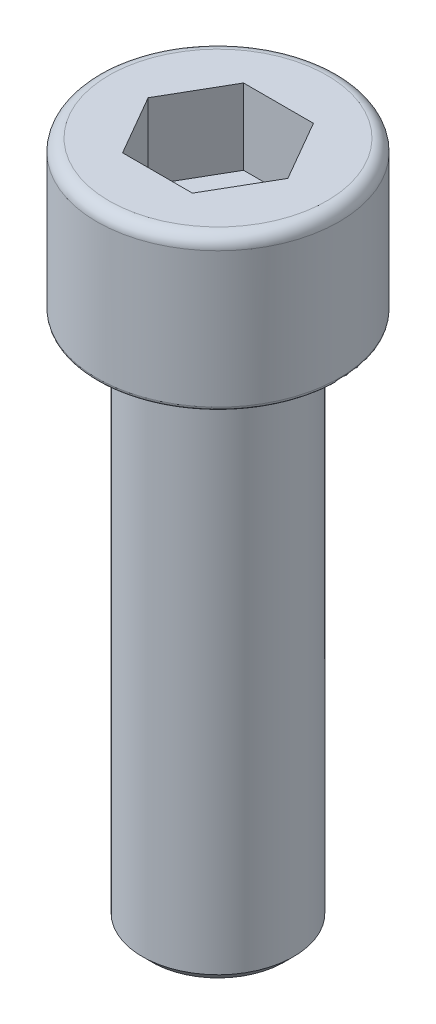
ISO-10303-21;
HEADER;
FILE_DESCRIPTION(('STEP AP214'),'2;1');
FILE_NAME('part.step','',(''),(''),'','','');
FILE_SCHEMA(('AUTOMOTIVE_DESIGN { 1 0 10303 214 1 1 1 1 }'));
ENDSEC;
DATA;
#1=APPLICATION_CONTEXT('core data for automotive mechanical design processes');
#2=APPLICATION_PROTOCOL_DEFINITION('international standard','automotive_design',2000,#1);
#3=PRODUCT_CONTEXT('',#1,'mechanical');
#4=PRODUCT('Part','Part','',(#3));
#5=PRODUCT_RELATED_PRODUCT_CATEGORY('part','',(#4));
#6=PRODUCT_DEFINITION_FORMATION('','',#4);
#7=PRODUCT_DEFINITION_CONTEXT('part definition',#1,'design');
#8=PRODUCT_DEFINITION('design','',#6,#7);
#9=PRODUCT_DEFINITION_SHAPE('','',#8);
#10=(LENGTH_UNIT() NAMED_UNIT(*) SI_UNIT(.MILLI.,.METRE.));
#11=(NAMED_UNIT(*) PLANE_ANGLE_UNIT() SI_UNIT($,.RADIAN.));
#12=(NAMED_UNIT(*) SI_UNIT($,.STERADIAN.) SOLID_ANGLE_UNIT());
#13=UNCERTAINTY_MEASURE_WITH_UNIT(LENGTH_MEASURE(1.E-05),#10,'distance_accuracy_value','');
#14=(GEOMETRIC_REPRESENTATION_CONTEXT(3) GLOBAL_UNCERTAINTY_ASSIGNED_CONTEXT((#13)) GLOBAL_UNIT_ASSIGNED_CONTEXT((#10,
#11,#12)) REPRESENTATION_CONTEXT('',''));
#15=CARTESIAN_POINT('',(0.,0.,0.));
#16=DIRECTION('',(0.,0.,1.));
#17=DIRECTION('',(1.,0.,0.));
#18=AXIS2_PLACEMENT_3D('',#15,#16,#17);
#19=CARTESIAN_POINT('',(0.,0.,0.));
#20=DIRECTION('',(0.,1.,0.));
#21=DIRECTION('',(0.,0.,1.));
#22=AXIS2_PLACEMENT_3D('',#19,#20,#21);
#23=PLANE('',#22);
#24=CARTESIAN_POINT('',(0.,0.,0.));
#25=DIRECTION('',(0.,1.,0.));
#26=DIRECTION('',(0.,0.,1.));
#27=AXIS2_PLACEMENT_3D('',#24,#25,#26);
#28=CIRCLE('',#27,7.2);
#29=CARTESIAN_POINT('',(0.,0.,7.2));
#30=VERTEX_POINT('',#29);
#31=EDGE_CURVE('E158',#30,#30,#28,.T.);
#32=ORIENTED_EDGE('',*,*,#31,.T.);
#33=EDGE_LOOP('',(#32));
#34=FACE_BOUND('',#33,.T.);
#35=DIRECTION('',(0.5,0.,-0.866025403784439));
#36=VECTOR('',#35,1.);
#37=CARTESIAN_POINT('',(2.3094010767585,0.,4.));
#38=LINE('',#37,#36);
#39=CARTESIAN_POINT('',(2.3094010767585,0.,4.));
#40=VERTEX_POINT('',#39);
#41=CARTESIAN_POINT('',(4.61880215351701,0.,0.));
#42=VERTEX_POINT('',#41);
#43=EDGE_CURVE('E63',#40,#42,#38,.T.);
#44=ORIENTED_EDGE('',*,*,#43,.F.);
#45=DIRECTION('',(1.,0.,0.));
#46=VECTOR('',#45,1.);
#47=CARTESIAN_POINT('',(-2.3094010767585,0.,4.));
#48=LINE('',#47,#46);
#49=CARTESIAN_POINT('',(-2.3094010767585,0.,4.));
#50=VERTEX_POINT('',#49);
#51=EDGE_CURVE('E146',#50,#40,#48,.T.);
#52=ORIENTED_EDGE('',*,*,#51,.F.);
#53=DIRECTION('',(0.5,0.,0.866025403784439));
#54=VECTOR('',#53,1.);
#55=CARTESIAN_POINT('',(-4.61880215351701,0.,0.));
#56=LINE('',#55,#54);
#57=CARTESIAN_POINT('',(-4.61880215351701,0.,0.));
#58=VERTEX_POINT('',#57);
#59=EDGE_CURVE('E144',#58,#50,#56,.T.);
#60=ORIENTED_EDGE('',*,*,#59,.F.);
#61=DIRECTION('',(-0.5,0.,0.866025403784439));
#62=VECTOR('',#61,1.);
#63=CARTESIAN_POINT('',(-2.3094010767585,0.,-4.));
#64=LINE('',#63,#62);
#65=CARTESIAN_POINT('',(-2.3094010767585,0.,-4.));
#66=VERTEX_POINT('',#65);
#67=EDGE_CURVE('E111',#66,#58,#64,.T.);
#68=ORIENTED_EDGE('',*,*,#67,.F.);
#69=DIRECTION('',(-1.,0.,0.));
#70=VECTOR('',#69,1.);
#71=CARTESIAN_POINT('',(2.3094010767585,0.,-4.));
#72=LINE('',#71,#70);
#73=CARTESIAN_POINT('',(2.3094010767585,0.,-4.));
#74=VERTEX_POINT('',#73);
#75=EDGE_CURVE('E140',#74,#66,#72,.T.);
#76=ORIENTED_EDGE('',*,*,#75,.F.);
#77=DIRECTION('',(-0.5,0.,-0.866025403784439));
#78=VECTOR('',#77,1.);
#79=CARTESIAN_POINT('',(4.61880215351701,0.,0.));
#80=LINE('',#79,#78);
#81=EDGE_CURVE('E137',#42,#74,#80,.T.);
#82=ORIENTED_EDGE('',*,*,#81,.F.);
#83=EDGE_LOOP('',(#44,#52,#60,#68,#76,#82));
#84=FACE_BOUND('',#83,.T.);
#85=ADVANCED_FACE('F48',(#34,#84),#23,.T.);
#86=CARTESIAN_POINT('',(0.,-50.,0.));
#87=DIRECTION('',(0.,-1.,0.));
#88=DIRECTION('',(0.,0.,-1.));
#89=AXIS2_PLACEMENT_3D('',#86,#87,#88);
#90=CYLINDRICAL_SURFACE('',#89,8.);
#91=CARTESIAN_POINT('',(0.,-9.75,0.));
#92=DIRECTION('',(0.,-1.,0.));
#93=DIRECTION('',(0.,0.,-1.));
#94=AXIS2_PLACEMENT_3D('',#91,#92,#93);
#95=CIRCLE('',#94,8.);
#96=CARTESIAN_POINT('',(0.,-9.75,-8.));
#97=VERTEX_POINT('',#96);
#98=EDGE_CURVE('E11',#97,#97,#95,.F.);
#99=ORIENTED_EDGE('',*,*,#98,.T.);
#100=EDGE_LOOP('',(#99));
#101=FACE_BOUND('',#100,.T.);
#102=CARTESIAN_POINT('',(0.,-0.800000000000002,0.));
#103=DIRECTION('',(0.,1.,0.));
#104=DIRECTION('',(0.,0.,1.));
#105=AXIS2_PLACEMENT_3D('',#102,#103,#104);
#106=CIRCLE('',#105,8.);
#107=CARTESIAN_POINT('',(0.,-0.800000000000002,8.));
#108=VERTEX_POINT('',#107);
#109=EDGE_CURVE('E150',#108,#108,#106,.F.);
#110=ORIENTED_EDGE('',*,*,#109,.T.);
#111=EDGE_LOOP('',(#110));
#112=FACE_BOUND('',#111,.T.);
#113=ADVANCED_FACE('F207',(#101,#112),#90,.T.);
#114=CARTESIAN_POINT('',(8.,-10.,0.));
#115=DIRECTION('',(0.,-1.,0.));
#116=DIRECTION('',(0.,0.,-1.));
#117=AXIS2_PLACEMENT_3D('',#114,#115,#116);
#118=PLANE('',#117);
#119=CARTESIAN_POINT('',(0.,-10.,0.));
#120=DIRECTION('',(0.,-1.,0.));
#121=DIRECTION('',(0.,0.,-1.));
#122=AXIS2_PLACEMENT_3D('',#119,#120,#121);
#123=CIRCLE('',#122,5.25);
#124=CARTESIAN_POINT('',(0.,-10.,-5.25));
#125=VERTEX_POINT('',#124);
#126=EDGE_CURVE('E56',#125,#125,#123,.F.);
#127=ORIENTED_EDGE('',*,*,#126,.T.);
#128=EDGE_LOOP('',(#127));
#129=FACE_BOUND('',#128,.T.);
#130=CARTESIAN_POINT('',(0.,-10.,0.));
#131=DIRECTION('',(0.,-1.,0.));
#132=DIRECTION('',(0.,0.,-1.));
#133=AXIS2_PLACEMENT_3D('',#130,#131,#132);
#134=CIRCLE('',#133,7.75);
#135=CARTESIAN_POINT('',(0.,-10.,-7.75));
#136=VERTEX_POINT('',#135);
#137=EDGE_CURVE('E170',#136,#136,#134,.T.);
#138=ORIENTED_EDGE('',*,*,#137,.T.);
#139=EDGE_LOOP('',(#138));
#140=FACE_BOUND('',#139,.T.);
#141=ADVANCED_FACE('F175',(#129,#140),#118,.T.);
#142=CARTESIAN_POINT('',(0.,-50.,0.));
#143=DIRECTION('',(0.,-1.,0.));
#144=DIRECTION('',(0.,0.,-1.));
#145=AXIS2_PLACEMENT_3D('',#142,#143,#144);
#146=CYLINDRICAL_SURFACE('',#145,5.);
#147=CARTESIAN_POINT('',(0.,-10.25,0.));
#148=DIRECTION('',(0.,-1.,0.));
#149=DIRECTION('',(0.,0.,-1.));
#150=AXIS2_PLACEMENT_3D('',#147,#148,#149);
#151=CIRCLE('',#150,5.);
#152=CARTESIAN_POINT('',(0.,-10.25,-5.));
#153=VERTEX_POINT('',#152);
#154=EDGE_CURVE('E167',#153,#153,#151,.T.);
#155=ORIENTED_EDGE('',*,*,#154,.T.);
#156=EDGE_LOOP('',(#155));
#157=FACE_BOUND('',#156,.T.);
#158=CARTESIAN_POINT('',(0.,-44.375,0.));
#159=DIRECTION('',(0.,-1.,0.));
#160=DIRECTION('',(0.,0.,-1.));
#161=AXIS2_PLACEMENT_3D('',#158,#159,#160);
#162=CIRCLE('',#161,5.);
#163=CARTESIAN_POINT('',(0.,-44.375,-5.));
#164=VERTEX_POINT('',#163);
#165=EDGE_CURVE('E164',#164,#164,#162,.F.);
#166=ORIENTED_EDGE('',*,*,#165,.T.);
#167=EDGE_LOOP('',(#166));
#168=FACE_BOUND('',#167,.T.);
#169=ADVANCED_FACE('F184',(#157,#168),#146,.T.);
#170=CARTESIAN_POINT('',(5.,-45.,0.));
#171=DIRECTION('',(0.,-1.,0.));
#172=DIRECTION('',(0.,0.,-1.));
#173=AXIS2_PLACEMENT_3D('',#170,#171,#172);
#174=PLANE('',#173);
#175=CARTESIAN_POINT('',(0.,-45.,0.));
#176=DIRECTION('',(0.,-1.,0.));
#177=DIRECTION('',(0.,0.,-1.));
#178=AXIS2_PLACEMENT_3D('',#175,#176,#177);
#179=CIRCLE('',#178,4.375);
#180=CARTESIAN_POINT('',(0.,-45.,-4.375));
#181=VERTEX_POINT('',#180);
#182=EDGE_CURVE('E161',#181,#181,#179,.T.);
#183=ORIENTED_EDGE('',*,*,#182,.T.);
#184=EDGE_LOOP('',(#183));
#185=FACE_BOUND('',#184,.T.);
#186=ADVANCED_FACE('F187',(#185),#174,.T.);
#187=CARTESIAN_POINT('',(2.3094010767585,-5.,4.));
#188=DIRECTION('',(0.866025403784439,0.,0.5));
#189=DIRECTION('',(0.5,0.,-0.866025403784439));
#190=AXIS2_PLACEMENT_3D('',#187,#188,#189);
#191=PLANE('',#190);
#192=ORIENTED_EDGE('',*,*,#43,.T.);
#193=DIRECTION('',(0.,1.,0.));
#194=VECTOR('',#193,1.);
#195=CARTESIAN_POINT('',(4.61880215351701,-5.,0.));
#196=LINE('',#195,#194);
#197=CARTESIAN_POINT('',(4.61880215351701,-5.,0.));
#198=VERTEX_POINT('',#197);
#199=EDGE_CURVE('E93',#198,#42,#196,.T.);
#200=ORIENTED_EDGE('',*,*,#199,.F.);
#201=DIRECTION('',(0.5,0.,-0.866025403784439));
#202=VECTOR('',#201,1.);
#203=CARTESIAN_POINT('',(2.3094010767585,-5.,4.));
#204=LINE('',#203,#202);
#205=CARTESIAN_POINT('',(2.3094010767585,-5.,4.));
#206=VERTEX_POINT('',#205);
#207=EDGE_CURVE('E148',#206,#198,#204,.T.);
#208=ORIENTED_EDGE('',*,*,#207,.F.);
#209=DIRECTION('',(0.,1.,0.));
#210=VECTOR('',#209,1.);
#211=CARTESIAN_POINT('',(2.3094010767585,-5.,4.));
#212=LINE('',#211,#210);
#213=EDGE_CURVE('E71',#206,#40,#212,.T.);
#214=ORIENTED_EDGE('',*,*,#213,.T.);
#215=EDGE_LOOP('',(#192,#200,#208,#214));
#216=FACE_BOUND('',#215,.T.);
#217=ADVANCED_FACE('F198',(#216),#191,.F.);
#218=CARTESIAN_POINT('',(-2.3094010767585,-5.,4.));
#219=DIRECTION('',(0.,0.,1.));
#220=DIRECTION('',(1.,0.,0.));
#221=AXIS2_PLACEMENT_3D('',#218,#219,#220);
#222=PLANE('',#221);
#223=ORIENTED_EDGE('',*,*,#51,.T.);
#224=ORIENTED_EDGE('',*,*,#213,.F.);
#225=DIRECTION('',(1.,0.,0.));
#226=VECTOR('',#225,1.);
#227=CARTESIAN_POINT('',(-2.3094010767585,-5.,4.));
#228=LINE('',#227,#226);
#229=CARTESIAN_POINT('',(-2.3094010767585,-5.,4.));
#230=VERTEX_POINT('',#229);
#231=EDGE_CURVE('E123',#230,#206,#228,.T.);
#232=ORIENTED_EDGE('',*,*,#231,.F.);
#233=DIRECTION('',(0.,1.,0.));
#234=VECTOR('',#233,1.);
#235=CARTESIAN_POINT('',(-2.3094010767585,-5.,4.));
#236=LINE('',#235,#234);
#237=EDGE_CURVE('E115',#230,#50,#236,.T.);
#238=ORIENTED_EDGE('',*,*,#237,.T.);
#239=EDGE_LOOP('',(#223,#224,#232,#238));
#240=FACE_BOUND('',#239,.T.);
#241=ADVANCED_FACE('F204',(#240),#222,.F.);
#242=CARTESIAN_POINT('',(-4.61880215351701,-5.,0.));
#243=DIRECTION('',(-0.866025403784438,0.,0.5));
#244=DIRECTION('',(0.5,0.,0.866025403784439));
#245=AXIS2_PLACEMENT_3D('',#242,#243,#244);
#246=PLANE('',#245);
#247=ORIENTED_EDGE('',*,*,#59,.T.);
#248=ORIENTED_EDGE('',*,*,#237,.F.);
#249=DIRECTION('',(0.5,0.,0.866025403784439));
#250=VECTOR('',#249,1.);
#251=CARTESIAN_POINT('',(-4.61880215351701,-5.,0.));
#252=LINE('',#251,#250);
#253=CARTESIAN_POINT('',(-4.61880215351701,-5.,0.));
#254=VERTEX_POINT('',#253);
#255=EDGE_CURVE('E119',#254,#230,#252,.T.);
#256=ORIENTED_EDGE('',*,*,#255,.F.);
#257=DIRECTION('',(0.,1.,0.));
#258=VECTOR('',#257,1.);
#259=CARTESIAN_POINT('',(-4.61880215351701,-5.,0.));
#260=LINE('',#259,#258);
#261=EDGE_CURVE('E104',#254,#58,#260,.T.);
#262=ORIENTED_EDGE('',*,*,#261,.T.);
#263=EDGE_LOOP('',(#247,#248,#256,#262));
#264=FACE_BOUND('',#263,.T.);
#265=ADVANCED_FACE('F120',(#264),#246,.F.);
#266=CARTESIAN_POINT('',(-2.3094010767585,-5.,-4.));
#267=DIRECTION('',(-0.866025403784439,0.,-0.5));
#268=DIRECTION('',(-0.5,0.,0.866025403784439));
#269=AXIS2_PLACEMENT_3D('',#266,#267,#268);
#270=PLANE('',#269);
#271=ORIENTED_EDGE('',*,*,#67,.T.);
#272=ORIENTED_EDGE('',*,*,#261,.F.);
#273=DIRECTION('',(-0.5,0.,0.866025403784439));
#274=VECTOR('',#273,1.);
#275=CARTESIAN_POINT('',(-2.3094010767585,-5.,-4.));
#276=LINE('',#275,#274);
#277=CARTESIAN_POINT('',(-2.3094010767585,-5.,-4.));
#278=VERTEX_POINT('',#277);
#279=EDGE_CURVE('E108',#278,#254,#276,.T.);
#280=ORIENTED_EDGE('',*,*,#279,.F.);
#281=DIRECTION('',(0.,1.,0.));
#282=VECTOR('',#281,1.);
#283=CARTESIAN_POINT('',(-2.3094010767585,-5.,-4.));
#284=LINE('',#283,#282);
#285=EDGE_CURVE('E116',#278,#66,#284,.T.);
#286=ORIENTED_EDGE('',*,*,#285,.T.);
#287=EDGE_LOOP('',(#271,#272,#280,#286));
#288=FACE_BOUND('',#287,.T.);
#289=ADVANCED_FACE('F106',(#288),#270,.F.);
#290=CARTESIAN_POINT('',(2.3094010767585,-5.,-4.));
#291=DIRECTION('',(0.,0.,-1.));
#292=DIRECTION('',(-1.,0.,0.));
#293=AXIS2_PLACEMENT_3D('',#290,#291,#292);
#294=PLANE('',#293);
#295=ORIENTED_EDGE('',*,*,#75,.T.);
#296=ORIENTED_EDGE('',*,*,#285,.F.);
#297=DIRECTION('',(-1.,0.,0.));
#298=VECTOR('',#297,1.);
#299=CARTESIAN_POINT('',(2.3094010767585,-5.,-4.));
#300=LINE('',#299,#298);
#301=CARTESIAN_POINT('',(2.3094010767585,-5.,-4.));
#302=VERTEX_POINT('',#301);
#303=EDGE_CURVE('E129',#302,#278,#300,.T.);
#304=ORIENTED_EDGE('',*,*,#303,.F.);
#305=DIRECTION('',(0.,1.,0.));
#306=VECTOR('',#305,1.);
#307=CARTESIAN_POINT('',(2.3094010767585,-5.,-4.));
#308=LINE('',#307,#306);
#309=EDGE_CURVE('E153',#302,#74,#308,.T.);
#310=ORIENTED_EDGE('',*,*,#309,.T.);
#311=EDGE_LOOP('',(#295,#296,#304,#310));
#312=FACE_BOUND('',#311,.T.);
#313=ADVANCED_FACE('F235',(#312),#294,.F.);
#314=CARTESIAN_POINT('',(4.61880215351701,-5.,0.));
#315=DIRECTION('',(0.866025403784439,0.,-0.5));
#316=DIRECTION('',(-0.5,0.,-0.866025403784439));
#317=AXIS2_PLACEMENT_3D('',#314,#315,#316);
#318=PLANE('',#317);
#319=ORIENTED_EDGE('',*,*,#81,.T.);
#320=ORIENTED_EDGE('',*,*,#309,.F.);
#321=DIRECTION('',(-0.5,0.,-0.866025403784439));
#322=VECTOR('',#321,1.);
#323=CARTESIAN_POINT('',(4.61880215351701,-5.,0.));
#324=LINE('',#323,#322);
#325=EDGE_CURVE('E131',#198,#302,#324,.T.);
#326=ORIENTED_EDGE('',*,*,#325,.F.);
#327=ORIENTED_EDGE('',*,*,#199,.T.);
#328=EDGE_LOOP('',(#319,#320,#326,#327));
#329=FACE_BOUND('',#328,.T.);
#330=ADVANCED_FACE('F226',(#329),#318,.F.);
#331=CARTESIAN_POINT('',(0.,-5.,0.));
#332=DIRECTION('',(0.,1.,0.));
#333=DIRECTION('',(0.,0.,1.));
#334=AXIS2_PLACEMENT_3D('',#331,#332,#333);
#335=PLANE('',#334);
#336=ORIENTED_EDGE('',*,*,#207,.T.);
#337=ORIENTED_EDGE('',*,*,#325,.T.);
#338=ORIENTED_EDGE('',*,*,#303,.T.);
#339=ORIENTED_EDGE('',*,*,#279,.T.);
#340=ORIENTED_EDGE('',*,*,#255,.T.);
#341=ORIENTED_EDGE('',*,*,#231,.T.);
#342=EDGE_LOOP('',(#336,#337,#338,#339,#340,#341));
#343=FACE_BOUND('',#342,.T.);
#344=ADVANCED_FACE('F126',(#343),#335,.T.);
#345=CARTESIAN_POINT('',(0.,-0.800000000000002,0.));
#346=DIRECTION('',(0.,1.,0.));
#347=DIRECTION('',(0.,0.,1.));
#348=AXIS2_PLACEMENT_3D('',#345,#346,#347);
#349=TOROIDAL_SURFACE('',#348,7.2,0.8);
#350=ORIENTED_EDGE('',*,*,#31,.F.);
#351=EDGE_LOOP('',(#350));
#352=FACE_BOUND('',#351,.T.);
#353=ORIENTED_EDGE('',*,*,#109,.F.);
#354=EDGE_LOOP('',(#353));
#355=FACE_BOUND('',#354,.T.);
#356=ADVANCED_FACE('F193',(#352,#355),#349,.T.);
#357=CARTESIAN_POINT('',(0.,-45.,0.));
#358=DIRECTION('',(0.,1.,0.));
#359=DIRECTION('',(0.,0.,1.));
#360=AXIS2_PLACEMENT_3D('',#357,#358,#359);
#361=CONICAL_SURFACE('',#360,4.375,0.785398163397447);
#362=ORIENTED_EDGE('',*,*,#165,.F.);
#363=EDGE_LOOP('',(#362));
#364=FACE_BOUND('',#363,.T.);
#365=ORIENTED_EDGE('',*,*,#182,.F.);
#366=EDGE_LOOP('',(#365));
#367=FACE_BOUND('',#366,.T.);
#368=ADVANCED_FACE('F181',(#364,#367),#361,.T.);
#369=CARTESIAN_POINT('',(0.,-10.25,0.));
#370=DIRECTION('',(0.,-1.,0.));
#371=DIRECTION('',(0.,0.,-1.));
#372=AXIS2_PLACEMENT_3D('',#369,#370,#371);
#373=TOROIDAL_SURFACE('',#372,5.25,0.25);
#374=ORIENTED_EDGE('',*,*,#126,.F.);
#375=EDGE_LOOP('',(#374));
#376=FACE_BOUND('',#375,.T.);
#377=ORIENTED_EDGE('',*,*,#154,.F.);
#378=EDGE_LOOP('',(#377));
#379=FACE_BOUND('',#378,.T.);
#380=ADVANCED_FACE('F178',(#376,#379),#373,.F.);
#381=CARTESIAN_POINT('',(0.,-9.75,0.));
#382=DIRECTION('',(0.,-1.,0.));
#383=DIRECTION('',(0.,0.,-1.));
#384=AXIS2_PLACEMENT_3D('',#381,#382,#383);
#385=TOROIDAL_SURFACE('',#384,7.75,0.25);
#386=ORIENTED_EDGE('',*,*,#98,.F.);
#387=EDGE_LOOP('',(#386));
#388=FACE_BOUND('',#387,.T.);
#389=ORIENTED_EDGE('',*,*,#137,.F.);
#390=EDGE_LOOP('',(#389));
#391=FACE_BOUND('',#390,.T.);
#392=ADVANCED_FACE('F50',(#388,#391),#385,.T.);
#393=CLOSED_SHELL('',(#85,#113,#141,#169,#186,#217,#241,#265,#289,#313,#330,#344,#356,#368,#380,#392));
#394=MANIFOLD_SOLID_BREP('B2',#393);
#395=ADVANCED_BREP_SHAPE_REPRESENTATION('',(#18,#394),#14);
#396=SHAPE_DEFINITION_REPRESENTATION(#9,#395);
ENDSEC;
END-ISO-10303-21;
